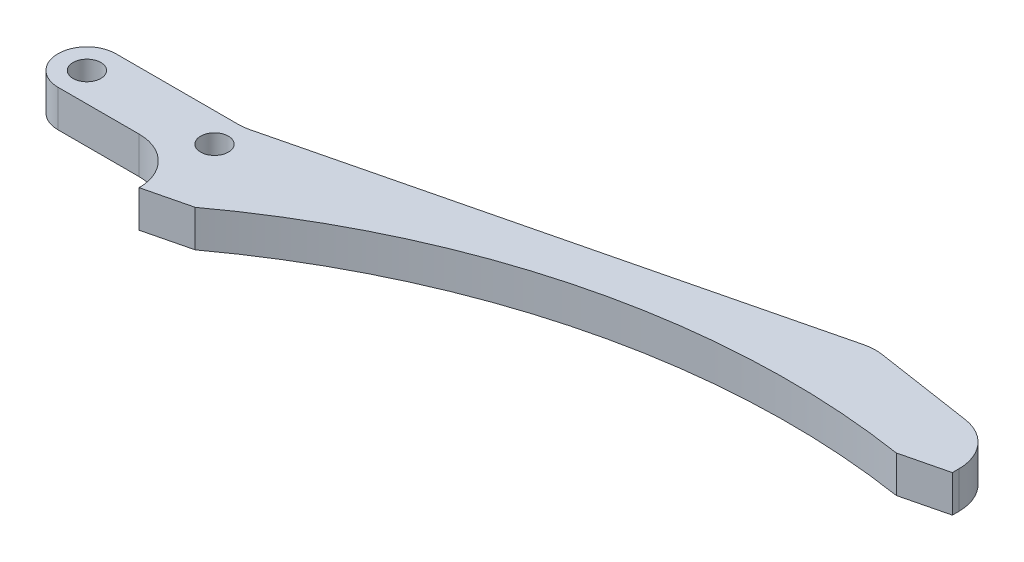
ISO-10303-21;
HEADER;
FILE_DESCRIPTION(('STEP AP214'),'2;1');
FILE_NAME('part.step','',(''),(''),'','','');
FILE_SCHEMA(('AUTOMOTIVE_DESIGN { 1 0 10303 214 1 1 1 1 }'));
ENDSEC;
DATA;
#1=APPLICATION_CONTEXT('core data for automotive mechanical design processes');
#2=APPLICATION_PROTOCOL_DEFINITION('international standard','automotive_design',2000,#1);
#3=PRODUCT_CONTEXT('',#1,'mechanical');
#4=PRODUCT('Part','Part','',(#3));
#5=PRODUCT_RELATED_PRODUCT_CATEGORY('part','',(#4));
#6=PRODUCT_DEFINITION_FORMATION('','',#4);
#7=PRODUCT_DEFINITION_CONTEXT('part definition',#1,'design');
#8=PRODUCT_DEFINITION('design','',#6,#7);
#9=PRODUCT_DEFINITION_SHAPE('','',#8);
#10=(LENGTH_UNIT() NAMED_UNIT(*) SI_UNIT(.MILLI.,.METRE.));
#11=(NAMED_UNIT(*) PLANE_ANGLE_UNIT() SI_UNIT($,.RADIAN.));
#12=(NAMED_UNIT(*) SI_UNIT($,.STERADIAN.) SOLID_ANGLE_UNIT());
#13=UNCERTAINTY_MEASURE_WITH_UNIT(LENGTH_MEASURE(1.E-05),#10,'distance_accuracy_value','');
#14=(GEOMETRIC_REPRESENTATION_CONTEXT(3) GLOBAL_UNCERTAINTY_ASSIGNED_CONTEXT((#13)) GLOBAL_UNIT_ASSIGNED_CONTEXT((#10,
#11,#12)) REPRESENTATION_CONTEXT('',''));
#15=CARTESIAN_POINT('',(0.,0.,0.));
#16=DIRECTION('',(0.,0.,1.));
#17=DIRECTION('',(1.,0.,0.));
#18=AXIS2_PLACEMENT_3D('',#15,#16,#17);
#19=CARTESIAN_POINT('',(115.905519120562,125.72290121311,-12.6677240526969));
#20=DIRECTION('',(-0.237664111599045,0.,-0.971347399264464));
#21=DIRECTION('',(-0.971347399264463,0.,0.237664111599045));
#22=AXIS2_PLACEMENT_3D('',#19,#20,#21);
#23=PLANE('',#22);
#24=DIRECTION('',(0.,-1.,0.));
#25=VECTOR('',#24,1.);
#26=CARTESIAN_POINT('',(115.905519120562,374.055526217005,-12.6677240526969));
#27=LINE('',#26,#25);
#28=CARTESIAN_POINT('',(115.905519120562,0.,-12.6677240526969));
#29=VERTEX_POINT('',#28);
#30=CARTESIAN_POINT('',(115.905519120562,6.35999999999998,-12.6677240526969));
#31=VERTEX_POINT('',#30);
#32=EDGE_CURVE('E11',#29,#31,#27,.F.);
#33=ORIENTED_EDGE('',*,*,#32,.F.);
#34=DIRECTION('',(0.971347399264463,0.,-0.237664111599045));
#35=VECTOR('',#34,1.);
#36=CARTESIAN_POINT('',(115.905519120562,0.,-12.6677240526969));
#37=LINE('',#36,#35);
#38=CARTESIAN_POINT('',(123.676298314678,0.,-14.5690369454892));
#39=VERTEX_POINT('',#38);
#40=EDGE_CURVE('E180',#29,#39,#37,.T.);
#41=ORIENTED_EDGE('',*,*,#40,.T.);
#42=DIRECTION('',(0.,-1.,0.));
#43=VECTOR('',#42,1.);
#44=CARTESIAN_POINT('',(123.676298314678,125.72290121311,-14.5690369454892));
#45=LINE('',#44,#43);
#46=CARTESIAN_POINT('',(123.676298314678,6.36,-14.5690369454892));
#47=VERTEX_POINT('',#46);
#48=EDGE_CURVE('E164',#47,#39,#45,.T.);
#49=ORIENTED_EDGE('',*,*,#48,.F.);
#50=DIRECTION('',(0.971347399264463,0.,-0.237664111599045));
#51=VECTOR('',#50,1.);
#52=CARTESIAN_POINT('',(115.905519120562,6.36,-12.6677240526969));
#53=LINE('',#52,#51);
#54=EDGE_CURVE('E155',#31,#47,#53,.T.);
#55=ORIENTED_EDGE('',*,*,#54,.F.);
#56=EDGE_LOOP('',(#33,#41,#49,#55));
#57=FACE_BOUND('',#56,.T.);
#58=ADVANCED_FACE('F43',(#57),#23,.F.);
#59=DIRECTION('',(0.,-1.,0.));
#60=VECTOR('',#59,1.);
#61=CARTESIAN_POINT('',(18.7707791941158,374.055526217005,11.0986871072075));
#62=LINE('',#61,#60);
#63=CARTESIAN_POINT('',(18.7707791941157,6.36,11.0986871072076));
#64=VERTEX_POINT('',#63);
#65=CARTESIAN_POINT('',(18.7707791941157,0.,11.0986871072076));
#66=VERTEX_POINT('',#65);
#67=EDGE_CURVE('E52',#64,#66,#62,.T.);
#68=ORIENTED_EDGE('',*,*,#67,.F.);
#69=CARTESIAN_POINT('',(11.,6.36,13.));
#70=VERTEX_POINT('',#69);
#71=EDGE_CURVE('E158',#70,#64,#53,.T.);
#72=ORIENTED_EDGE('',*,*,#71,.F.);
#73=DIRECTION('',(0.,-1.,0.));
#74=VECTOR('',#73,1.);
#75=CARTESIAN_POINT('',(11.,125.72290121311,13.));
#76=LINE('',#75,#74);
#77=CARTESIAN_POINT('',(11.,0.,13.));
#78=VERTEX_POINT('',#77);
#79=EDGE_CURVE('E160',#70,#78,#76,.T.);
#80=ORIENTED_EDGE('',*,*,#79,.T.);
#81=EDGE_CURVE('E184',#78,#66,#37,.T.);
#82=ORIENTED_EDGE('',*,*,#81,.T.);
#83=EDGE_LOOP('',(#68,#72,#80,#82));
#84=FACE_BOUND('',#83,.T.);
#85=ADVANCED_FACE('F297',(#84),#23,.F.);
#86=CARTESIAN_POINT('',(-16.,6.36,-5.));
#87=DIRECTION('',(0.,0.,1.));
#88=DIRECTION('',(1.,0.,0.));
#89=AXIS2_PLACEMENT_3D('',#86,#87,#88);
#90=PLANE('',#89);
#91=DIRECTION('',(-1.,0.,0.));
#92=VECTOR('',#91,1.);
#93=CARTESIAN_POINT('',(-16.,6.36,-5.));
#94=LINE('',#93,#92);
#95=CARTESIAN_POINT('',(10.0355262124262,6.36,-5.));
#96=VERTEX_POINT('',#95);
#97=CARTESIAN_POINT('',(-11.,6.36,-5.));
#98=VERTEX_POINT('',#97);
#99=EDGE_CURVE('E203',#96,#98,#94,.T.);
#100=ORIENTED_EDGE('',*,*,#99,.F.);
#101=DIRECTION('',(0.,-1.,0.));
#102=VECTOR('',#101,1.);
#103=CARTESIAN_POINT('',(10.0355262124262,0.,-5.));
#104=LINE('',#103,#102);
#105=CARTESIAN_POINT('',(10.0355262124262,0.,-5.));
#106=VERTEX_POINT('',#105);
#107=EDGE_CURVE('E263',#96,#106,#104,.T.);
#108=ORIENTED_EDGE('',*,*,#107,.T.);
#109=DIRECTION('',(-1.,0.,0.));
#110=VECTOR('',#109,1.);
#111=CARTESIAN_POINT('',(-16.,0.,-5.));
#112=LINE('',#111,#110);
#113=CARTESIAN_POINT('',(-11.,0.,-5.));
#114=VERTEX_POINT('',#113);
#115=EDGE_CURVE('E199',#106,#114,#112,.T.);
#116=ORIENTED_EDGE('',*,*,#115,.T.);
#117=DIRECTION('',(0.,-1.,0.));
#118=VECTOR('',#117,1.);
#119=CARTESIAN_POINT('',(-11.,6.36,-5.));
#120=LINE('',#119,#118);
#121=EDGE_CURVE('E233',#114,#98,#120,.F.);
#122=ORIENTED_EDGE('',*,*,#121,.T.);
#123=EDGE_LOOP('',(#100,#108,#116,#122));
#124=FACE_BOUND('',#123,.T.);
#125=ADVANCED_FACE('F343',(#124),#90,.F.);
#126=CARTESIAN_POINT('',(-16.,6.36,5.));
#127=DIRECTION('',(0.,0.,-1.));
#128=DIRECTION('',(-1.,0.,0.));
#129=AXIS2_PLACEMENT_3D('',#126,#127,#128);
#130=PLANE('',#129);
#131=DIRECTION('',(1.,0.,0.));
#132=VECTOR('',#131,1.);
#133=CARTESIAN_POINT('',(-16.,0.,5.));
#134=LINE('',#133,#132);
#135=CARTESIAN_POINT('',(-11.,0.,5.));
#136=VERTEX_POINT('',#135);
#137=CARTESIAN_POINT('',(3.,0.,5.));
#138=VERTEX_POINT('',#137);
#139=EDGE_CURVE('E207',#136,#138,#134,.T.);
#140=ORIENTED_EDGE('',*,*,#139,.T.);
#141=DIRECTION('',(0.,-1.,0.));
#142=VECTOR('',#141,1.);
#143=CARTESIAN_POINT('',(3.,6.36,5.));
#144=LINE('',#143,#142);
#145=CARTESIAN_POINT('',(3.,6.36,5.));
#146=VERTEX_POINT('',#145);
#147=EDGE_CURVE('E254',#138,#146,#144,.F.);
#148=ORIENTED_EDGE('',*,*,#147,.T.);
#149=DIRECTION('',(1.,0.,0.));
#150=VECTOR('',#149,1.);
#151=CARTESIAN_POINT('',(-16.,6.36,5.));
#152=LINE('',#151,#150);
#153=CARTESIAN_POINT('',(-11.,6.36,5.));
#154=VERTEX_POINT('',#153);
#155=EDGE_CURVE('E206',#154,#146,#152,.T.);
#156=ORIENTED_EDGE('',*,*,#155,.F.);
#157=DIRECTION('',(0.,-1.,0.));
#158=VECTOR('',#157,1.);
#159=CARTESIAN_POINT('',(-11.,6.36,5.));
#160=LINE('',#159,#158);
#161=EDGE_CURVE('E211',#154,#136,#160,.T.);
#162=ORIENTED_EDGE('',*,*,#161,.T.);
#163=EDGE_LOOP('',(#140,#148,#156,#162));
#164=FACE_BOUND('',#163,.T.);
#165=ADVANCED_FACE('F355',(#164),#130,.F.);
#166=CARTESIAN_POINT('',(0.,6.36,0.));
#167=DIRECTION('',(0.,1.,0.));
#168=DIRECTION('',(0.,0.,1.));
#169=AXIS2_PLACEMENT_3D('',#166,#167,#168);
#170=PLANE('',#169);
#171=ORIENTED_EDGE('',*,*,#71,.T.);
#172=CARTESIAN_POINT('',(95.8578425492242,6.35999999999998,115.777169438991));
#173=DIRECTION('',(0.,1.,0.));
#174=DIRECTION('',(0.,0.,1.));
#175=AXIS2_PLACEMENT_3D('',#172,#173,#174);
#176=CIRCLE('',#175,130.);
#177=EDGE_CURVE('E58',#31,#64,#176,.T.);
#178=ORIENTED_EDGE('',*,*,#177,.F.);
#179=ORIENTED_EDGE('',*,*,#54,.T.);
#180=DIRECTION('',(0.,0.,-1.));
#181=VECTOR('',#180,1.);
#182=CARTESIAN_POINT('',(123.676298314678,6.36,-14.5690369454892));
#183=LINE('',#182,#181);
#184=CARTESIAN_POINT('',(123.676298314678,6.36,-15.6882931282562));
#185=VERTEX_POINT('',#184);
#186=EDGE_CURVE('E170',#47,#185,#183,.T.);
#187=ORIENTED_EDGE('',*,*,#186,.T.);
#188=CARTESIAN_POINT('',(115.676298314678,6.36,-15.6882931282562));
#189=DIRECTION('',(0.,1.,0.));
#190=DIRECTION('',(0.,0.,1.));
#191=AXIS2_PLACEMENT_3D('',#188,#189,#190);
#192=CIRCLE('',#191,8.);
#193=CARTESIAN_POINT('',(116.872969493315,6.36,-23.598285422198));
#194=VERTEX_POINT('',#193);
#195=EDGE_CURVE('E251',#185,#194,#192,.T.);
#196=ORIENTED_EDGE('',*,*,#195,.T.);
#197=DIRECTION('',(-0.988749036742724,0.,-0.149583897329675));
#198=VECTOR('',#197,1.);
#199=CARTESIAN_POINT('',(123.676298314678,6.36,-22.5690369454892));
#200=LINE('',#199,#198);
#201=CARTESIAN_POINT('',(99.984009842826,6.36,-26.1533487522077));
#202=VERTEX_POINT('',#201);
#203=EDGE_CURVE('E241',#194,#202,#200,.T.);
#204=ORIENTED_EDGE('',*,*,#203,.T.);
#205=CARTESIAN_POINT('',(98.7873386641886,6.36,-18.2433564582659));
#206=DIRECTION('',(0.,1.,0.));
#207=DIRECTION('',(0.,0.,1.));
#208=AXIS2_PLACEMENT_3D('',#205,#206,#207);
#209=CIRCLE('',#208,8.);
#210=CARTESIAN_POINT('',(96.8860257713962,6.36,-26.0141356523817));
#211=VERTEX_POINT('',#210);
#212=EDGE_CURVE('E279',#202,#211,#209,.T.);
#213=ORIENTED_EDGE('',*,*,#212,.T.);
#214=DIRECTION('',(-0.971347399264463,0.,0.237664111599045));
#215=VECTOR('',#214,1.);
#216=CARTESIAN_POINT('',(11.,6.36,-5.));
#217=LINE('',#216,#215);
#218=CARTESIAN_POINT('',(11.9368391052186,6.36,-5.22922080588429));
#219=VERTEX_POINT('',#218);
#220=EDGE_CURVE('E166',#211,#219,#217,.T.);
#221=ORIENTED_EDGE('',*,*,#220,.T.);
#222=CARTESIAN_POINT('',(10.0355262124262,6.36,-13.));
#223=DIRECTION('',(0.,1.,0.));
#224=DIRECTION('',(0.,0.,1.));
#225=AXIS2_PLACEMENT_3D('',#222,#223,#224);
#226=CIRCLE('',#225,8.);
#227=EDGE_CURVE('E285',#219,#96,#226,.F.);
#228=ORIENTED_EDGE('',*,*,#227,.T.);
#229=ORIENTED_EDGE('',*,*,#99,.T.);
#230=CARTESIAN_POINT('',(-11.,6.36,0.));
#231=DIRECTION('',(0.,1.,0.));
#232=DIRECTION('',(0.,0.,1.));
#233=AXIS2_PLACEMENT_3D('',#230,#231,#232);
#234=CIRCLE('',#233,5.);
#235=CARTESIAN_POINT('',(-16.,6.36,0.));
#236=VERTEX_POINT('',#235);
#237=EDGE_CURVE('E227',#98,#236,#234,.T.);
#238=ORIENTED_EDGE('',*,*,#237,.T.);
#239=CARTESIAN_POINT('',(-11.,6.36,0.));
#240=DIRECTION('',(0.,1.,0.));
#241=DIRECTION('',(0.,0.,1.));
#242=AXIS2_PLACEMENT_3D('',#239,#240,#241);
#243=CIRCLE('',#242,5.);
#244=EDGE_CURVE('E230',#236,#154,#243,.T.);
#245=ORIENTED_EDGE('',*,*,#244,.T.);
#246=ORIENTED_EDGE('',*,*,#155,.T.);
#247=CARTESIAN_POINT('',(3.,6.36,13.));
#248=DIRECTION('',(0.,1.,0.));
#249=DIRECTION('',(0.,0.,1.));
#250=AXIS2_PLACEMENT_3D('',#247,#248,#249);
#251=CIRCLE('',#250,8.);
#252=EDGE_CURVE('E260',#146,#70,#251,.F.);
#253=ORIENTED_EDGE('',*,*,#252,.T.);
#254=EDGE_LOOP('',(#171,#178,#179,#187,#196,#204,#213,#221,#228,#229,#238,#245,#246,#253));
#255=FACE_BOUND('',#254,.T.);
#256=CARTESIAN_POINT('',(11.,6.36,0.));
#257=DIRECTION('',(0.,1.,0.));
#258=DIRECTION('',(0.,0.,1.));
#259=AXIS2_PLACEMENT_3D('',#256,#257,#258);
#260=CIRCLE('',#259,2.395);
#261=CARTESIAN_POINT('',(11.,6.36,-2.395));
#262=VERTEX_POINT('',#261);
#263=EDGE_CURVE('E195',#262,#262,#260,.T.);
#264=ORIENTED_EDGE('',*,*,#263,.F.);
#265=EDGE_LOOP('',(#264));
#266=FACE_BOUND('',#265,.T.);
#267=CARTESIAN_POINT('',(-11.,6.36,0.));
#268=DIRECTION('',(0.,1.,0.));
#269=DIRECTION('',(0.,0.,1.));
#270=AXIS2_PLACEMENT_3D('',#267,#268,#269);
#271=CIRCLE('',#270,2.395);
#272=CARTESIAN_POINT('',(-11.,6.36,-2.395));
#273=VERTEX_POINT('',#272);
#274=EDGE_CURVE('E185',#273,#273,#271,.T.);
#275=ORIENTED_EDGE('',*,*,#274,.F.);
#276=EDGE_LOOP('',(#275));
#277=FACE_BOUND('',#276,.T.);
#278=ADVANCED_FACE('F152',(#255,#266,#277),#170,.T.);
#279=CARTESIAN_POINT('',(0.,0.,0.));
#280=DIRECTION('',(0.,1.,0.));
#281=DIRECTION('',(0.,0.,1.));
#282=AXIS2_PLACEMENT_3D('',#279,#280,#281);
#283=PLANE('',#282);
#284=CARTESIAN_POINT('',(95.8578425492242,0.,115.777169438991));
#285=DIRECTION('',(0.,1.,0.));
#286=DIRECTION('',(0.,0.,1.));
#287=AXIS2_PLACEMENT_3D('',#284,#285,#286);
#288=CIRCLE('',#287,130.);
#289=EDGE_CURVE('E146',#29,#66,#288,.T.);
#290=ORIENTED_EDGE('',*,*,#289,.T.);
#291=ORIENTED_EDGE('',*,*,#81,.F.);
#292=CARTESIAN_POINT('',(3.,0.,13.));
#293=DIRECTION('',(0.,1.,0.));
#294=DIRECTION('',(0.,0.,1.));
#295=AXIS2_PLACEMENT_3D('',#292,#293,#294);
#296=CIRCLE('',#295,8.);
#297=EDGE_CURVE('E257',#78,#138,#296,.T.);
#298=ORIENTED_EDGE('',*,*,#297,.T.);
#299=ORIENTED_EDGE('',*,*,#139,.F.);
#300=CARTESIAN_POINT('',(-11.,0.,0.));
#301=DIRECTION('',(0.,1.,0.));
#302=DIRECTION('',(0.,0.,1.));
#303=AXIS2_PLACEMENT_3D('',#300,#301,#302);
#304=CIRCLE('',#303,5.);
#305=CARTESIAN_POINT('',(-16.,0.,0.));
#306=VERTEX_POINT('',#305);
#307=EDGE_CURVE('E224',#136,#306,#304,.F.);
#308=ORIENTED_EDGE('',*,*,#307,.T.);
#309=CARTESIAN_POINT('',(-11.,0.,0.));
#310=DIRECTION('',(0.,1.,0.));
#311=DIRECTION('',(0.,0.,1.));
#312=AXIS2_PLACEMENT_3D('',#309,#310,#311);
#313=CIRCLE('',#312,5.);
#314=EDGE_CURVE('E220',#306,#114,#313,.F.);
#315=ORIENTED_EDGE('',*,*,#314,.T.);
#316=ORIENTED_EDGE('',*,*,#115,.F.);
#317=CARTESIAN_POINT('',(10.0355262124262,0.,-13.));
#318=DIRECTION('',(0.,1.,0.));
#319=DIRECTION('',(0.,0.,1.));
#320=AXIS2_PLACEMENT_3D('',#317,#318,#319);
#321=CIRCLE('',#320,8.);
#322=CARTESIAN_POINT('',(11.9368391052186,0.,-5.22922080588429));
#323=VERTEX_POINT('',#322);
#324=EDGE_CURVE('E282',#106,#323,#321,.T.);
#325=ORIENTED_EDGE('',*,*,#324,.T.);
#326=DIRECTION('',(-0.971347399264463,0.,0.237664111599045));
#327=VECTOR('',#326,1.);
#328=CARTESIAN_POINT('',(11.,0.,-5.));
#329=LINE('',#328,#327);
#330=CARTESIAN_POINT('',(96.8860257713962,0.,-26.0141356523817));
#331=VERTEX_POINT('',#330);
#332=EDGE_CURVE('E172',#331,#323,#329,.T.);
#333=ORIENTED_EDGE('',*,*,#332,.F.);
#334=CARTESIAN_POINT('',(98.7873386641886,0.,-18.2433564582659));
#335=DIRECTION('',(0.,1.,0.));
#336=DIRECTION('',(0.,0.,1.));
#337=AXIS2_PLACEMENT_3D('',#334,#335,#336);
#338=CIRCLE('',#337,8.);
#339=CARTESIAN_POINT('',(99.984009842826,0.,-26.1533487522077));
#340=VERTEX_POINT('',#339);
#341=EDGE_CURVE('E274',#331,#340,#338,.F.);
#342=ORIENTED_EDGE('',*,*,#341,.T.);
#343=DIRECTION('',(-0.988749036742724,0.,-0.149583897329675));
#344=VECTOR('',#343,1.);
#345=CARTESIAN_POINT('',(123.676298314678,0.,-22.5690369454892));
#346=LINE('',#345,#344);
#347=CARTESIAN_POINT('',(116.872969493315,0.,-23.598285422198));
#348=VERTEX_POINT('',#347);
#349=EDGE_CURVE('E315',#348,#340,#346,.T.);
#350=ORIENTED_EDGE('',*,*,#349,.F.);
#351=CARTESIAN_POINT('',(115.676298314678,0.,-15.6882931282562));
#352=DIRECTION('',(0.,1.,0.));
#353=DIRECTION('',(0.,0.,1.));
#354=AXIS2_PLACEMENT_3D('',#351,#352,#353);
#355=CIRCLE('',#354,8.);
#356=CARTESIAN_POINT('',(123.676298314678,0.,-15.6882931282562));
#357=VERTEX_POINT('',#356);
#358=EDGE_CURVE('E245',#348,#357,#355,.F.);
#359=ORIENTED_EDGE('',*,*,#358,.T.);
#360=DIRECTION('',(0.,0.,-1.));
#361=VECTOR('',#360,1.);
#362=CARTESIAN_POINT('',(123.676298314678,0.,-14.5690369454892));
#363=LINE('',#362,#361);
#364=EDGE_CURVE('E183',#39,#357,#363,.T.);
#365=ORIENTED_EDGE('',*,*,#364,.F.);
#366=ORIENTED_EDGE('',*,*,#40,.F.);
#367=EDGE_LOOP('',(#290,#291,#298,#299,#308,#315,#316,#325,#333,#342,#350,#359,#365,#366));
#368=FACE_BOUND('',#367,.T.);
#369=CARTESIAN_POINT('',(11.,0.,0.));
#370=DIRECTION('',(0.,1.,0.));
#371=DIRECTION('',(0.,0.,1.));
#372=AXIS2_PLACEMENT_3D('',#369,#370,#371);
#373=CIRCLE('',#372,2.395);
#374=CARTESIAN_POINT('',(11.,0.,-2.395));
#375=VERTEX_POINT('',#374);
#376=EDGE_CURVE('E189',#375,#375,#373,.T.);
#377=ORIENTED_EDGE('',*,*,#376,.T.);
#378=EDGE_LOOP('',(#377));
#379=FACE_BOUND('',#378,.T.);
#380=CARTESIAN_POINT('',(-11.,0.,0.));
#381=DIRECTION('',(0.,1.,0.));
#382=DIRECTION('',(0.,0.,1.));
#383=AXIS2_PLACEMENT_3D('',#380,#381,#382);
#384=CIRCLE('',#383,2.395);
#385=CARTESIAN_POINT('',(-11.,0.,-2.395));
#386=VERTEX_POINT('',#385);
#387=EDGE_CURVE('E190',#386,#386,#384,.T.);
#388=ORIENTED_EDGE('',*,*,#387,.T.);
#389=EDGE_LOOP('',(#388));
#390=FACE_BOUND('',#389,.T.);
#391=ADVANCED_FACE('F292',(#368,#379,#390),#283,.F.);
#392=CARTESIAN_POINT('',(11.,6.36,0.));
#393=DIRECTION('',(0.,-1.,0.));
#394=DIRECTION('',(0.,0.,-1.));
#395=AXIS2_PLACEMENT_3D('',#392,#393,#394);
#396=CYLINDRICAL_SURFACE('',#395,2.395);
#397=CARTESIAN_POINT('',(11.,6.36,-2.395));
#398=CARTESIAN_POINT('',(11.,6.29375,-2.395));
#399=CARTESIAN_POINT('',(11.,6.2275,-2.395));
#400=CARTESIAN_POINT('',(11.,6.095,-2.395));
#401=CARTESIAN_POINT('',(11.,6.02875,-2.395));
#402=CARTESIAN_POINT('',(11.,5.89625,-2.395));
#403=CARTESIAN_POINT('',(11.,5.83,-2.395));
#404=CARTESIAN_POINT('',(11.,5.6975,-2.395));
#405=CARTESIAN_POINT('',(11.,5.63125,-2.395));
#406=CARTESIAN_POINT('',(11.,5.49875,-2.395));
#407=CARTESIAN_POINT('',(11.,5.4325,-2.395));
#408=CARTESIAN_POINT('',(11.,5.3,-2.395));
#409=CARTESIAN_POINT('',(11.,5.23375,-2.395));
#410=CARTESIAN_POINT('',(11.,5.10125,-2.395));
#411=CARTESIAN_POINT('',(11.,5.035,-2.395));
#412=CARTESIAN_POINT('',(11.,4.9025,-2.395));
#413=CARTESIAN_POINT('',(11.,4.83625,-2.395));
#414=CARTESIAN_POINT('',(11.,4.70375,-2.395));
#415=CARTESIAN_POINT('',(11.,4.6375,-2.395));
#416=CARTESIAN_POINT('',(11.,4.505,-2.395));
#417=CARTESIAN_POINT('',(11.,4.43875,-2.395));
#418=CARTESIAN_POINT('',(11.,4.30625,-2.395));
#419=CARTESIAN_POINT('',(11.,4.24,-2.395));
#420=CARTESIAN_POINT('',(11.,4.1075,-2.395));
#421=CARTESIAN_POINT('',(11.,4.04125,-2.395));
#422=CARTESIAN_POINT('',(11.,3.90875,-2.395));
#423=CARTESIAN_POINT('',(11.,3.8425,-2.395));
#424=CARTESIAN_POINT('',(11.,3.71,-2.395));
#425=CARTESIAN_POINT('',(11.,3.64375,-2.395));
#426=CARTESIAN_POINT('',(11.,3.51125,-2.395));
#427=CARTESIAN_POINT('',(11.,3.445,-2.395));
#428=CARTESIAN_POINT('',(11.,3.3125,-2.395));
#429=CARTESIAN_POINT('',(11.,3.24625,-2.395));
#430=CARTESIAN_POINT('',(11.,3.11375,-2.395));
#431=CARTESIAN_POINT('',(11.,3.0475,-2.395));
#432=CARTESIAN_POINT('',(11.,2.915,-2.395));
#433=CARTESIAN_POINT('',(11.,2.84875,-2.395));
#434=CARTESIAN_POINT('',(11.,2.71625,-2.395));
#435=CARTESIAN_POINT('',(11.,2.65,-2.395));
#436=CARTESIAN_POINT('',(11.,2.5175,-2.395));
#437=CARTESIAN_POINT('',(11.,2.45125,-2.395));
#438=CARTESIAN_POINT('',(11.,2.31875,-2.395));
#439=CARTESIAN_POINT('',(11.,2.2525,-2.395));
#440=CARTESIAN_POINT('',(11.,2.12,-2.395));
#441=CARTESIAN_POINT('',(11.,2.05375,-2.395));
#442=CARTESIAN_POINT('',(11.,1.92125,-2.395));
#443=CARTESIAN_POINT('',(11.,1.855,-2.395));
#444=CARTESIAN_POINT('',(11.,1.7225,-2.395));
#445=CARTESIAN_POINT('',(11.,1.65625,-2.395));
#446=CARTESIAN_POINT('',(11.,1.52375,-2.395));
#447=CARTESIAN_POINT('',(11.,1.4575,-2.395));
#448=CARTESIAN_POINT('',(11.,1.325,-2.395));
#449=CARTESIAN_POINT('',(11.,1.25875,-2.395));
#450=CARTESIAN_POINT('',(11.,1.12625,-2.395));
#451=CARTESIAN_POINT('',(11.,1.06,-2.395));
#452=CARTESIAN_POINT('',(11.,0.9275,-2.395));
#453=CARTESIAN_POINT('',(11.,0.86125,-2.395));
#454=CARTESIAN_POINT('',(11.,0.72875,-2.395));
#455=CARTESIAN_POINT('',(11.,0.6625,-2.395));
#456=CARTESIAN_POINT('',(11.,0.53,-2.395));
#457=CARTESIAN_POINT('',(11.,0.46375,-2.395));
#458=CARTESIAN_POINT('',(11.,0.33125,-2.395));
#459=CARTESIAN_POINT('',(11.,0.265,-2.395));
#460=CARTESIAN_POINT('',(11.,0.1325,-2.395));
#461=CARTESIAN_POINT('',(11.,0.0662500000000001,-2.395));
#462=CARTESIAN_POINT('',(11.,0.,-2.395));
#463=B_SPLINE_CURVE_WITH_KNOTS('',3,(#397,#398,#399,#400,#401,#402,#403,#404,#405,#406,#407,
#408,#409,#410,#411,#412,#413,#414,#415,#416,#417,#418,#419,#420,#421,#422,#423,#424,#425,#426,
#427,#428,#429,#430,#431,#432,#433,#434,#435,#436,#437,#438,#439,#440,#441,#442,#443,#444,#445,
#446,#447,#448,#449,#450,#451,#452,#453,#454,#455,#456,#457,#458,#459,#460,#461,#462),
.UNSPECIFIED.,.F.,.F.,(4,2,2,2,2,2,2,2,2,2,2,2,2,2,2,2,2,2,2,2,2,2,2,2,2,2,2,2,2,2,2,2,4),(0.,
0.198749999999999,0.397499999999999,0.59625,0.795,0.99375,1.1925,1.39125,1.59,1.78875,1.9875,
2.18625,2.385,2.58375,2.7825,2.98125,3.18,3.37875,3.5775,3.77625,3.975,4.17375,4.3725,4.57125,
4.77,4.96875,5.1675,5.36625,5.565,5.76375,5.9625,6.16125,6.36),.UNSPECIFIED.);
#464=EDGE_CURVE('BSEAM348',#262,#375,#463,.T.);
#465=ORIENTED_EDGE('',*,*,#263,.T.);
#466=ORIENTED_EDGE('',*,*,#376,.F.);
#467=ORIENTED_EDGE('',*,*,#464,.T.);
#468=ORIENTED_EDGE('',*,*,#464,.F.);
#469=EDGE_LOOP('',(#465,#467,#466,#468));
#470=FACE_BOUND('',#469,.T.);
#471=ADVANCED_FACE('F348',(#470),#396,.F.);
#472=CARTESIAN_POINT('',(-11.,6.36,0.));
#473=DIRECTION('',(0.,-1.,0.));
#474=DIRECTION('',(0.,0.,-1.));
#475=AXIS2_PLACEMENT_3D('',#472,#473,#474);
#476=CYLINDRICAL_SURFACE('',#475,2.395);
#477=CARTESIAN_POINT('',(-11.,6.36,-2.395));
#478=CARTESIAN_POINT('',(-11.,6.29375,-2.395));
#479=CARTESIAN_POINT('',(-11.,6.2275,-2.395));
#480=CARTESIAN_POINT('',(-11.,6.095,-2.395));
#481=CARTESIAN_POINT('',(-11.,6.02875,-2.395));
#482=CARTESIAN_POINT('',(-11.,5.89625,-2.395));
#483=CARTESIAN_POINT('',(-11.,5.83,-2.395));
#484=CARTESIAN_POINT('',(-11.,5.6975,-2.395));
#485=CARTESIAN_POINT('',(-11.,5.63125,-2.395));
#486=CARTESIAN_POINT('',(-11.,5.49875,-2.395));
#487=CARTESIAN_POINT('',(-11.,5.4325,-2.395));
#488=CARTESIAN_POINT('',(-11.,5.3,-2.395));
#489=CARTESIAN_POINT('',(-11.,5.23375,-2.395));
#490=CARTESIAN_POINT('',(-11.,5.10125,-2.395));
#491=CARTESIAN_POINT('',(-11.,5.035,-2.395));
#492=CARTESIAN_POINT('',(-11.,4.9025,-2.395));
#493=CARTESIAN_POINT('',(-11.,4.83625,-2.395));
#494=CARTESIAN_POINT('',(-11.,4.70375,-2.395));
#495=CARTESIAN_POINT('',(-11.,4.6375,-2.395));
#496=CARTESIAN_POINT('',(-11.,4.505,-2.395));
#497=CARTESIAN_POINT('',(-11.,4.43875,-2.395));
#498=CARTESIAN_POINT('',(-11.,4.30625,-2.395));
#499=CARTESIAN_POINT('',(-11.,4.24,-2.395));
#500=CARTESIAN_POINT('',(-11.,4.1075,-2.395));
#501=CARTESIAN_POINT('',(-11.,4.04125,-2.395));
#502=CARTESIAN_POINT('',(-11.,3.90875,-2.395));
#503=CARTESIAN_POINT('',(-11.,3.8425,-2.395));
#504=CARTESIAN_POINT('',(-11.,3.71,-2.395));
#505=CARTESIAN_POINT('',(-11.,3.64375,-2.395));
#506=CARTESIAN_POINT('',(-11.,3.51125,-2.395));
#507=CARTESIAN_POINT('',(-11.,3.445,-2.395));
#508=CARTESIAN_POINT('',(-11.,3.3125,-2.395));
#509=CARTESIAN_POINT('',(-11.,3.24625,-2.395));
#510=CARTESIAN_POINT('',(-11.,3.11375,-2.395));
#511=CARTESIAN_POINT('',(-11.,3.0475,-2.395));
#512=CARTESIAN_POINT('',(-11.,2.915,-2.395));
#513=CARTESIAN_POINT('',(-11.,2.84875,-2.395));
#514=CARTESIAN_POINT('',(-11.,2.71625,-2.395));
#515=CARTESIAN_POINT('',(-11.,2.65,-2.395));
#516=CARTESIAN_POINT('',(-11.,2.5175,-2.395));
#517=CARTESIAN_POINT('',(-11.,2.45125,-2.395));
#518=CARTESIAN_POINT('',(-11.,2.31875,-2.395));
#519=CARTESIAN_POINT('',(-11.,2.2525,-2.395));
#520=CARTESIAN_POINT('',(-11.,2.12,-2.395));
#521=CARTESIAN_POINT('',(-11.,2.05375,-2.395));
#522=CARTESIAN_POINT('',(-11.,1.92125,-2.395));
#523=CARTESIAN_POINT('',(-11.,1.855,-2.395));
#524=CARTESIAN_POINT('',(-11.,1.7225,-2.395));
#525=CARTESIAN_POINT('',(-11.,1.65625,-2.395));
#526=CARTESIAN_POINT('',(-11.,1.52375,-2.395));
#527=CARTESIAN_POINT('',(-11.,1.4575,-2.395));
#528=CARTESIAN_POINT('',(-11.,1.325,-2.395));
#529=CARTESIAN_POINT('',(-11.,1.25875,-2.395));
#530=CARTESIAN_POINT('',(-11.,1.12625,-2.395));
#531=CARTESIAN_POINT('',(-11.,1.06,-2.395));
#532=CARTESIAN_POINT('',(-11.,0.9275,-2.395));
#533=CARTESIAN_POINT('',(-11.,0.86125,-2.395));
#534=CARTESIAN_POINT('',(-11.,0.72875,-2.395));
#535=CARTESIAN_POINT('',(-11.,0.6625,-2.395));
#536=CARTESIAN_POINT('',(-11.,0.53,-2.395));
#537=CARTESIAN_POINT('',(-11.,0.46375,-2.395));
#538=CARTESIAN_POINT('',(-11.,0.33125,-2.395));
#539=CARTESIAN_POINT('',(-11.,0.265,-2.395));
#540=CARTESIAN_POINT('',(-11.,0.1325,-2.395));
#541=CARTESIAN_POINT('',(-11.,0.0662500000000001,-2.395));
#542=CARTESIAN_POINT('',(-11.,0.,-2.395));
#543=B_SPLINE_CURVE_WITH_KNOTS('',3,(#477,#478,#479,#480,#481,#482,#483,#484,#485,#486,#487,
#488,#489,#490,#491,#492,#493,#494,#495,#496,#497,#498,#499,#500,#501,#502,#503,#504,#505,#506,
#507,#508,#509,#510,#511,#512,#513,#514,#515,#516,#517,#518,#519,#520,#521,#522,#523,#524,#525,
#526,#527,#528,#529,#530,#531,#532,#533,#534,#535,#536,#537,#538,#539,#540,#541,#542),
.UNSPECIFIED.,.F.,.F.,(4,2,2,2,2,2,2,2,2,2,2,2,2,2,2,2,2,2,2,2,2,2,2,2,2,2,2,2,2,2,2,2,4),(0.,
0.198749999999999,0.397499999999999,0.59625,0.795,0.99375,1.1925,1.39125,1.59,1.78875,1.9875,
2.18625,2.385,2.58375,2.7825,2.98125,3.18,3.37875,3.5775,3.77625,3.975,4.17375,4.3725,4.57125,
4.77,4.96875,5.1675,5.36625,5.565,5.76375,5.9625,6.16125,6.36),.UNSPECIFIED.);
#544=EDGE_CURVE('BSEAM345',#273,#386,#543,.T.);
#545=ORIENTED_EDGE('',*,*,#274,.T.);
#546=ORIENTED_EDGE('',*,*,#387,.F.);
#547=ORIENTED_EDGE('',*,*,#544,.T.);
#548=ORIENTED_EDGE('',*,*,#544,.F.);
#549=EDGE_LOOP('',(#545,#547,#546,#548));
#550=FACE_BOUND('',#549,.T.);
#551=ADVANCED_FACE('F345',(#550),#476,.F.);
#552=CARTESIAN_POINT('',(-11.,6.36,0.));
#553=DIRECTION('',(0.,-1.,0.));
#554=DIRECTION('',(0.,0.,-1.));
#555=AXIS2_PLACEMENT_3D('',#552,#553,#554);
#556=CYLINDRICAL_SURFACE('',#555,5.);
#557=DIRECTION('',(0.,-1.,0.));
#558=VECTOR('',#557,1.);
#559=CARTESIAN_POINT('',(-16.,6.36,0.));
#560=LINE('',#559,#558);
#561=EDGE_CURVE('E194',#236,#306,#560,.T.);
#562=ORIENTED_EDGE('',*,*,#561,.F.);
#563=ORIENTED_EDGE('',*,*,#237,.F.);
#564=ORIENTED_EDGE('',*,*,#121,.F.);
#565=ORIENTED_EDGE('',*,*,#314,.F.);
#566=EDGE_LOOP('',(#562,#563,#564,#565));
#567=FACE_BOUND('',#566,.T.);
#568=ADVANCED_FACE('F334',(#567),#556,.T.);
#569=CARTESIAN_POINT('',(-11.,6.36,0.));
#570=DIRECTION('',(0.,-1.,0.));
#571=DIRECTION('',(0.,0.,-1.));
#572=AXIS2_PLACEMENT_3D('',#569,#570,#571);
#573=CYLINDRICAL_SURFACE('',#572,5.);
#574=ORIENTED_EDGE('',*,*,#244,.F.);
#575=ORIENTED_EDGE('',*,*,#561,.T.);
#576=ORIENTED_EDGE('',*,*,#307,.F.);
#577=ORIENTED_EDGE('',*,*,#161,.F.);
#578=EDGE_LOOP('',(#574,#575,#576,#577));
#579=FACE_BOUND('',#578,.T.);
#580=ADVANCED_FACE('F325',(#579),#573,.T.);
#581=CARTESIAN_POINT('',(123.676298314678,125.72290121311,-14.5690369454892));
#582=DIRECTION('',(-1.,0.,0.));
#583=DIRECTION('',(0.,0.,1.));
#584=AXIS2_PLACEMENT_3D('',#581,#582,#583);
#585=PLANE('',#584);
#586=ORIENTED_EDGE('',*,*,#364,.T.);
#587=DIRECTION('',(0.,-1.,0.));
#588=VECTOR('',#587,1.);
#589=CARTESIAN_POINT('',(123.676298314678,125.72290121311,-15.6882931282562));
#590=LINE('',#589,#588);
#591=EDGE_CURVE('E248',#357,#185,#590,.F.);
#592=ORIENTED_EDGE('',*,*,#591,.T.);
#593=ORIENTED_EDGE('',*,*,#186,.F.);
#594=ORIENTED_EDGE('',*,*,#48,.T.);
#595=EDGE_LOOP('',(#586,#592,#593,#594));
#596=FACE_BOUND('',#595,.T.);
#597=ADVANCED_FACE('F323',(#596),#585,.F.);
#598=CARTESIAN_POINT('',(123.676298314678,125.72290121311,-22.5690369454892));
#599=DIRECTION('',(-0.149583897329675,0.,0.988749036742724));
#600=DIRECTION('',(0.988749036742724,0.,0.149583897329675));
#601=AXIS2_PLACEMENT_3D('',#598,#599,#600);
#602=PLANE('',#601);
#603=ORIENTED_EDGE('',*,*,#349,.T.);
#604=DIRECTION('',(0.,-1.,0.));
#605=VECTOR('',#604,1.);
#606=CARTESIAN_POINT('',(99.984009842826,125.72290121311,-26.1533487522077));
#607=LINE('',#606,#605);
#608=EDGE_CURVE('E66',#340,#202,#607,.F.);
#609=ORIENTED_EDGE('',*,*,#608,.T.);
#610=ORIENTED_EDGE('',*,*,#203,.F.);
#611=DIRECTION('',(0.,-1.,0.));
#612=VECTOR('',#611,1.);
#613=CARTESIAN_POINT('',(116.872969493315,125.72290121311,-23.598285422198));
#614=LINE('',#613,#612);
#615=EDGE_CURVE('E237',#194,#348,#614,.T.);
#616=ORIENTED_EDGE('',*,*,#615,.T.);
#617=EDGE_LOOP('',(#603,#609,#610,#616));
#618=FACE_BOUND('',#617,.T.);
#619=ADVANCED_FACE('F314',(#618),#602,.F.);
#620=CARTESIAN_POINT('',(11.,125.72290121311,-5.));
#621=DIRECTION('',(0.237664111599045,0.,0.971347399264463));
#622=DIRECTION('',(0.971347399264463,0.,-0.237664111599045));
#623=AXIS2_PLACEMENT_3D('',#620,#621,#622);
#624=PLANE('',#623);
#625=ORIENTED_EDGE('',*,*,#332,.T.);
#626=DIRECTION('',(0.,-1.,0.));
#627=VECTOR('',#626,1.);
#628=CARTESIAN_POINT('',(11.9368391052186,6.36,-5.22922080588429));
#629=LINE('',#628,#627);
#630=EDGE_CURVE('E271',#323,#219,#629,.F.);
#631=ORIENTED_EDGE('',*,*,#630,.T.);
#632=ORIENTED_EDGE('',*,*,#220,.F.);
#633=DIRECTION('',(0.,-1.,0.));
#634=VECTOR('',#633,1.);
#635=CARTESIAN_POINT('',(96.8860257713962,125.72290121311,-26.0141356523817));
#636=LINE('',#635,#634);
#637=EDGE_CURVE('E267',#211,#331,#636,.T.);
#638=ORIENTED_EDGE('',*,*,#637,.T.);
#639=EDGE_LOOP('',(#625,#631,#632,#638));
#640=FACE_BOUND('',#639,.T.);
#641=ADVANCED_FACE('F331',(#640),#624,.F.);
#642=CARTESIAN_POINT('',(115.676298314678,125.72290121311,-15.6882931282562));
#643=DIRECTION('',(0.,-1.,0.));
#644=DIRECTION('',(0.,0.,-1.));
#645=AXIS2_PLACEMENT_3D('',#642,#643,#644);
#646=CYLINDRICAL_SURFACE('',#645,8.);
#647=ORIENTED_EDGE('',*,*,#195,.F.);
#648=ORIENTED_EDGE('',*,*,#591,.F.);
#649=ORIENTED_EDGE('',*,*,#358,.F.);
#650=ORIENTED_EDGE('',*,*,#615,.F.);
#651=EDGE_LOOP('',(#647,#648,#649,#650));
#652=FACE_BOUND('',#651,.T.);
#653=ADVANCED_FACE('F312',(#652),#646,.T.);
#654=CARTESIAN_POINT('',(3.,125.72290121311,13.));
#655=DIRECTION('',(0.,1.,0.));
#656=DIRECTION('',(0.,0.,1.));
#657=AXIS2_PLACEMENT_3D('',#654,#655,#656);
#658=CYLINDRICAL_SURFACE('',#657,8.);
#659=ORIENTED_EDGE('',*,*,#252,.F.);
#660=ORIENTED_EDGE('',*,*,#147,.F.);
#661=ORIENTED_EDGE('',*,*,#297,.F.);
#662=ORIENTED_EDGE('',*,*,#79,.F.);
#663=EDGE_LOOP('',(#659,#660,#661,#662));
#664=FACE_BOUND('',#663,.T.);
#665=ADVANCED_FACE('F368',(#664),#658,.F.);
#666=CARTESIAN_POINT('',(10.0355262124262,6.36,-13.));
#667=DIRECTION('',(0.,1.,0.));
#668=DIRECTION('',(0.,0.,1.));
#669=AXIS2_PLACEMENT_3D('',#666,#667,#668);
#670=CYLINDRICAL_SURFACE('',#669,8.);
#671=ORIENTED_EDGE('',*,*,#227,.F.);
#672=ORIENTED_EDGE('',*,*,#630,.F.);
#673=ORIENTED_EDGE('',*,*,#324,.F.);
#674=ORIENTED_EDGE('',*,*,#107,.F.);
#675=EDGE_LOOP('',(#671,#672,#673,#674));
#676=FACE_BOUND('',#675,.T.);
#677=ADVANCED_FACE('F370',(#676),#670,.F.);
#678=CARTESIAN_POINT('',(98.7873386641886,125.72290121311,-18.2433564582659));
#679=DIRECTION('',(0.,-1.,0.));
#680=DIRECTION('',(0.,0.,-1.));
#681=AXIS2_PLACEMENT_3D('',#678,#679,#680);
#682=CYLINDRICAL_SURFACE('',#681,8.);
#683=ORIENTED_EDGE('',*,*,#212,.F.);
#684=ORIENTED_EDGE('',*,*,#608,.F.);
#685=ORIENTED_EDGE('',*,*,#341,.F.);
#686=ORIENTED_EDGE('',*,*,#637,.F.);
#687=EDGE_LOOP('',(#683,#684,#685,#686));
#688=FACE_BOUND('',#687,.T.);
#689=ADVANCED_FACE('F45',(#688),#682,.T.);
#690=CARTESIAN_POINT('',(95.8578425492242,374.055526217005,115.777169438991));
#691=DIRECTION('',(0.,-1.,0.));
#692=DIRECTION('',(0.,0.,-1.));
#693=AXIS2_PLACEMENT_3D('',#690,#691,#692);
#694=CYLINDRICAL_SURFACE('',#693,130.);
#695=ORIENTED_EDGE('',*,*,#32,.T.);
#696=ORIENTED_EDGE('',*,*,#177,.T.);
#697=ORIENTED_EDGE('',*,*,#67,.T.);
#698=ORIENTED_EDGE('',*,*,#289,.F.);
#699=EDGE_LOOP('',(#695,#696,#697,#698));
#700=FACE_BOUND('',#699,.T.);
#701=ADVANCED_FACE('F144',(#700),#694,.F.);
#702=CLOSED_SHELL('',(#58,#85,#125,#165,#278,#391,#471,#551,#568,#580,#597,#619,#641,#653,#665,
#677,#689,#701));
#703=MANIFOLD_SOLID_BREP('B2',#702);
#704=ADVANCED_BREP_SHAPE_REPRESENTATION('',(#18,#703),#14);
#705=SHAPE_DEFINITION_REPRESENTATION(#9,#704);
ENDSEC;
END-ISO-10303-21;
